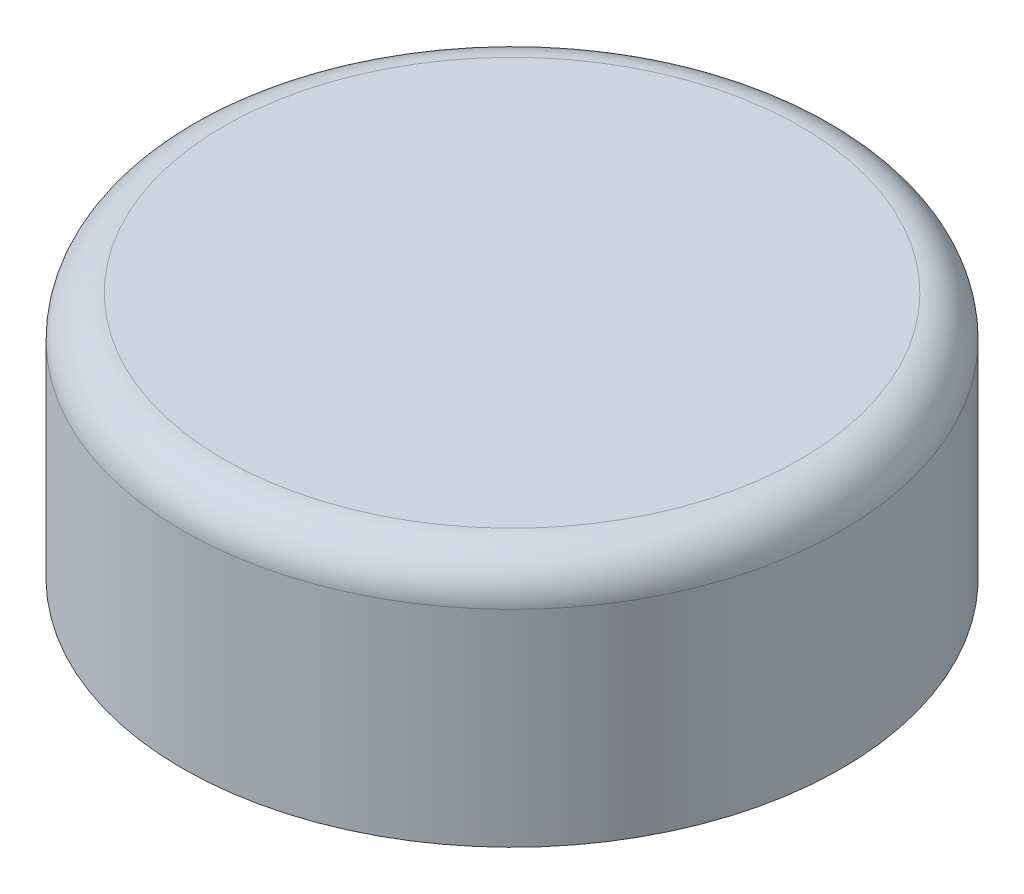
ISO-10303-21;
HEADER;
FILE_DESCRIPTION(('STEP AP214'),'2;1');
FILE_NAME('part.step','',(''),(''),'','','');
FILE_SCHEMA(('AUTOMOTIVE_DESIGN { 1 0 10303 214 1 1 1 1 }'));
ENDSEC;
DATA;
#1=APPLICATION_CONTEXT('core data for automotive mechanical design processes');
#2=APPLICATION_PROTOCOL_DEFINITION('international standard','automotive_design',2000,#1);
#3=PRODUCT_CONTEXT('',#1,'mechanical');
#4=PRODUCT('Part','Part','',(#3));
#5=PRODUCT_RELATED_PRODUCT_CATEGORY('part','',(#4));
#6=PRODUCT_DEFINITION_FORMATION('','',#4);
#7=PRODUCT_DEFINITION_CONTEXT('part definition',#1,'design');
#8=PRODUCT_DEFINITION('design','',#6,#7);
#9=PRODUCT_DEFINITION_SHAPE('','',#8);
#10=(LENGTH_UNIT() NAMED_UNIT(*) SI_UNIT(.MILLI.,.METRE.));
#11=(NAMED_UNIT(*) PLANE_ANGLE_UNIT() SI_UNIT($,.RADIAN.));
#12=(NAMED_UNIT(*) SI_UNIT($,.STERADIAN.) SOLID_ANGLE_UNIT());
#13=UNCERTAINTY_MEASURE_WITH_UNIT(LENGTH_MEASURE(1.E-05),#10,'distance_accuracy_value','');
#14=(GEOMETRIC_REPRESENTATION_CONTEXT(3) GLOBAL_UNCERTAINTY_ASSIGNED_CONTEXT((#13)) GLOBAL_UNIT_ASSIGNED_CONTEXT((#10,
#11,#12)) REPRESENTATION_CONTEXT('',''));
#15=CARTESIAN_POINT('',(0.,0.,0.));
#16=DIRECTION('',(0.,0.,1.));
#17=DIRECTION('',(1.,0.,0.));
#18=AXIS2_PLACEMENT_3D('',#15,#16,#17);
#19=CARTESIAN_POINT('',(0.,3.,0.));
#20=DIRECTION('',(0.,-1.,0.));
#21=DIRECTION('',(0.,0.,-1.));
#22=AXIS2_PLACEMENT_3D('',#19,#20,#21);
#23=CYLINDRICAL_SURFACE('',#22,4.);
#24=CARTESIAN_POINT('',(0.,2.5,0.));
#25=DIRECTION('',(0.,1.,0.));
#26=DIRECTION('',(0.,0.,1.));
#27=AXIS2_PLACEMENT_3D('',#24,#25,#26);
#28=CIRCLE('',#27,4.);
#29=CARTESIAN_POINT('',(0.,2.5,4.));
#30=VERTEX_POINT('',#29);
#31=EDGE_CURVE('E10',#30,#30,#28,.F.);
#32=ORIENTED_EDGE('',*,*,#31,.T.);
#33=EDGE_LOOP('',(#32));
#34=FACE_BOUND('',#33,.T.);
#35=CARTESIAN_POINT('',(0.,0.,0.));
#36=DIRECTION('',(0.,1.,0.));
#37=DIRECTION('',(0.,0.,1.));
#38=AXIS2_PLACEMENT_3D('',#35,#36,#37);
#39=CIRCLE('',#38,4.);
#40=CARTESIAN_POINT('',(0.,0.,4.));
#41=VERTEX_POINT('',#40);
#42=EDGE_CURVE('E41',#41,#41,#39,.T.);
#43=ORIENTED_EDGE('',*,*,#42,.T.);
#44=EDGE_LOOP('',(#43));
#45=FACE_BOUND('',#44,.T.);
#46=ADVANCED_FACE('F30',(#34,#45),#23,.T.);
#47=CARTESIAN_POINT('',(0.,3.,0.));
#48=DIRECTION('',(0.,1.,0.));
#49=DIRECTION('',(0.,0.,1.));
#50=AXIS2_PLACEMENT_3D('',#47,#48,#49);
#51=PLANE('',#50);
#52=CARTESIAN_POINT('',(0.,3.,0.));
#53=DIRECTION('',(0.,1.,0.));
#54=DIRECTION('',(0.,0.,1.));
#55=AXIS2_PLACEMENT_3D('',#52,#53,#54);
#56=CIRCLE('',#55,3.5);
#57=CARTESIAN_POINT('',(0.,3.,3.5));
#58=VERTEX_POINT('',#57);
#59=EDGE_CURVE('E37',#58,#58,#56,.T.);
#60=ORIENTED_EDGE('',*,*,#59,.T.);
#61=EDGE_LOOP('',(#60));
#62=FACE_BOUND('',#61,.T.);
#63=ADVANCED_FACE('F51',(#62),#51,.T.);
#64=CARTESIAN_POINT('',(0.,0.,0.));
#65=DIRECTION('',(0.,1.,0.));
#66=DIRECTION('',(0.,0.,1.));
#67=AXIS2_PLACEMENT_3D('',#64,#65,#66);
#68=PLANE('',#67);
#69=ORIENTED_EDGE('',*,*,#42,.F.);
#70=EDGE_LOOP('',(#69));
#71=FACE_BOUND('',#70,.T.);
#72=ADVANCED_FACE('F49',(#71),#68,.F.);
#73=CARTESIAN_POINT('',(0.,2.5,0.));
#74=DIRECTION('',(0.,1.,0.));
#75=DIRECTION('',(0.,0.,1.));
#76=AXIS2_PLACEMENT_3D('',#73,#74,#75);
#77=TOROIDAL_SURFACE('',#76,3.5,0.5);
#78=ORIENTED_EDGE('',*,*,#31,.F.);
#79=EDGE_LOOP('',(#78));
#80=FACE_BOUND('',#79,.T.);
#81=ORIENTED_EDGE('',*,*,#59,.F.);
#82=EDGE_LOOP('',(#81));
#83=FACE_BOUND('',#82,.T.);
#84=ADVANCED_FACE('F32',(#80,#83),#77,.T.);
#85=CLOSED_SHELL('',(#46,#63,#72,#84));
#86=MANIFOLD_SOLID_BREP('B2',#85);
#87=ADVANCED_BREP_SHAPE_REPRESENTATION('',(#18,#86),#14);
#88=SHAPE_DEFINITION_REPRESENTATION(#9,#87);
ENDSEC;
END-ISO-10303-21;
